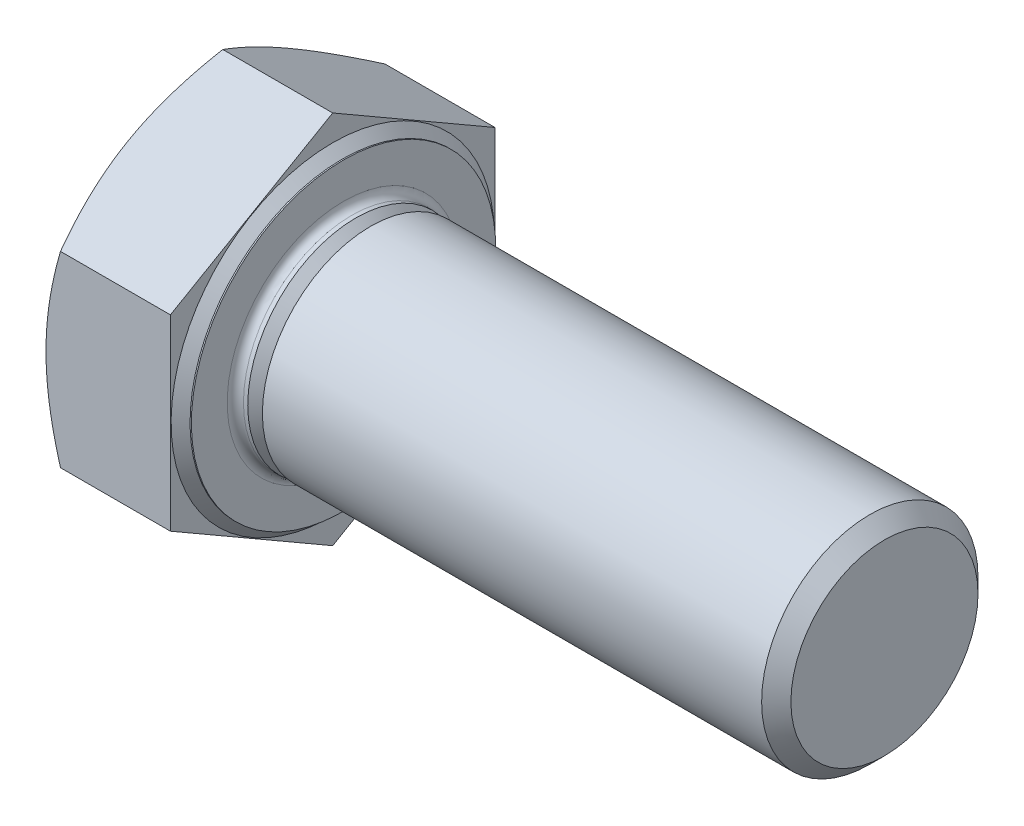
ISO-10303-21;
HEADER;
FILE_DESCRIPTION(('STEP AP214'),'2;1');
FILE_NAME('part.step','',(''),(''),'','','');
FILE_SCHEMA(('AUTOMOTIVE_DESIGN { 1 0 10303 214 1 1 1 1 }'));
ENDSEC;
DATA;
#1=APPLICATION_CONTEXT('core data for automotive mechanical design processes');
#2=APPLICATION_PROTOCOL_DEFINITION('international standard','automotive_design',2000,#1);
#3=PRODUCT_CONTEXT('',#1,'mechanical');
#4=PRODUCT('Part','Part','',(#3));
#5=PRODUCT_RELATED_PRODUCT_CATEGORY('part','',(#4));
#6=PRODUCT_DEFINITION_FORMATION('','',#4);
#7=PRODUCT_DEFINITION_CONTEXT('part definition',#1,'design');
#8=PRODUCT_DEFINITION('design','',#6,#7);
#9=PRODUCT_DEFINITION_SHAPE('','',#8);
#10=(LENGTH_UNIT() NAMED_UNIT(*) SI_UNIT(.MILLI.,.METRE.));
#11=(NAMED_UNIT(*) PLANE_ANGLE_UNIT() SI_UNIT($,.RADIAN.));
#12=(NAMED_UNIT(*) SI_UNIT($,.STERADIAN.) SOLID_ANGLE_UNIT());
#13=UNCERTAINTY_MEASURE_WITH_UNIT(LENGTH_MEASURE(1.E-05),#10,'distance_accuracy_value','');
#14=(GEOMETRIC_REPRESENTATION_CONTEXT(3) GLOBAL_UNCERTAINTY_ASSIGNED_CONTEXT((#13)) GLOBAL_UNIT_ASSIGNED_CONTEXT((#10,
#11,#12)) REPRESENTATION_CONTEXT('',''));
#15=CARTESIAN_POINT('',(0.,0.,0.));
#16=DIRECTION('',(0.,0.,1.));
#17=DIRECTION('',(1.,0.,0.));
#18=AXIS2_PLACEMENT_3D('',#15,#16,#17);
#19=CARTESIAN_POINT('',(0.35,0.,0.));
#20=DIRECTION('',(-1.,0.,0.));
#21=DIRECTION('',(0.,1.,0.));
#22=AXIS2_PLACEMENT_3D('',#19,#20,#21);
#23=CONICAL_SURFACE('',#22,11.6,0.785398163397448);
#24=CARTESIAN_POINT('',(0.7,0.,0.));
#25=DIRECTION('',(1.,0.,0.));
#26=DIRECTION('',(0.,1.,0.));
#27=AXIS2_PLACEMENT_3D('',#24,#25,#26);
#28=CIRCLE('',#27,11.25);
#29=CARTESIAN_POINT('',(0.7,11.25,0.));
#30=VERTEX_POINT('',#29);
#31=EDGE_CURVE('E10',#30,#30,#28,.T.);
#32=ORIENTED_EDGE('',*,*,#31,.F.);
#33=EDGE_LOOP('',(#32));
#34=FACE_BOUND('',#33,.T.);
#35=CARTESIAN_POINT('',(0.,0.,0.));
#36=DIRECTION('',(-1.,0.,0.));
#37=DIRECTION('',(0.,1.,0.));
#38=AXIS2_PLACEMENT_3D('',#35,#36,#37);
#39=CIRCLE('',#38,11.95);
#40=CARTESIAN_POINT('',(0.,11.95,0.));
#41=VERTEX_POINT('',#40);
#42=EDGE_CURVE('E262',#41,#41,#39,.T.);
#43=ORIENTED_EDGE('',*,*,#42,.F.);
#44=EDGE_LOOP('',(#43));
#45=FACE_BOUND('',#44,.T.);
#46=ADVANCED_FACE('F15',(#34,#45),#23,.T.);
#47=CARTESIAN_POINT('',(0.75,0.,0.));
#48=DIRECTION('',(-1.,0.,0.));
#49=DIRECTION('',(0.,1.,0.));
#50=AXIS2_PLACEMENT_3D('',#47,#48,#49);
#51=CYLINDRICAL_SURFACE('',#50,11.25);
#52=CARTESIAN_POINT('',(0.8,0.,0.));
#53=DIRECTION('',(1.,0.,0.));
#54=DIRECTION('',(0.,1.,0.));
#55=AXIS2_PLACEMENT_3D('',#52,#53,#54);
#56=CIRCLE('',#55,11.25);
#57=CARTESIAN_POINT('',(0.8,11.25,0.));
#58=VERTEX_POINT('',#57);
#59=EDGE_CURVE('E25',#58,#58,#56,.T.);
#60=ORIENTED_EDGE('',*,*,#59,.F.);
#61=EDGE_LOOP('',(#60));
#62=FACE_BOUND('',#61,.T.);
#63=ORIENTED_EDGE('',*,*,#31,.T.);
#64=EDGE_LOOP('',(#63));
#65=FACE_BOUND('',#64,.T.);
#66=ADVANCED_FACE('F315',(#62,#65),#51,.T.);
#67=CARTESIAN_POINT('',(0.8,9.925,0.));
#68=DIRECTION('',(1.,0.,0.));
#69=DIRECTION('',(0.,1.,0.));
#70=AXIS2_PLACEMENT_3D('',#67,#68,#69);
#71=PLANE('',#70);
#72=CARTESIAN_POINT('',(0.8,0.,0.));
#73=DIRECTION('',(1.,0.,0.));
#74=DIRECTION('',(0.,1.,0.));
#75=AXIS2_PLACEMENT_3D('',#72,#73,#74);
#76=CIRCLE('',#75,8.6);
#77=CARTESIAN_POINT('',(0.8,8.6,0.));
#78=VERTEX_POINT('',#77);
#79=EDGE_CURVE('E199',#78,#78,#76,.T.);
#80=ORIENTED_EDGE('',*,*,#79,.F.);
#81=EDGE_LOOP('',(#80));
#82=FACE_BOUND('',#81,.T.);
#83=ORIENTED_EDGE('',*,*,#59,.T.);
#84=EDGE_LOOP('',(#83));
#85=FACE_BOUND('',#84,.T.);
#86=ADVANCED_FACE('F320',(#82,#85),#71,.T.);
#87=CARTESIAN_POINT('',(1.4,0.,0.));
#88=DIRECTION('',(1.,0.,0.));
#89=DIRECTION('',(0.,0.,-1.));
#90=AXIS2_PLACEMENT_3D('',#87,#88,#89);
#91=TOROIDAL_SURFACE('',#90,8.6,0.6);
#92=CARTESIAN_POINT('',(1.4,0.,0.));
#93=DIRECTION('',(1.,0.,0.));
#94=DIRECTION('',(0.,1.,0.));
#95=AXIS2_PLACEMENT_3D('',#92,#93,#94);
#96=CIRCLE('',#95,8.);
#97=CARTESIAN_POINT('',(1.4,8.,0.));
#98=VERTEX_POINT('',#97);
#99=EDGE_CURVE('E201',#98,#98,#96,.T.);
#100=ORIENTED_EDGE('',*,*,#99,.F.);
#101=EDGE_LOOP('',(#100));
#102=FACE_BOUND('',#101,.T.);
#103=ORIENTED_EDGE('',*,*,#79,.T.);
#104=EDGE_LOOP('',(#103));
#105=FACE_BOUND('',#104,.T.);
#106=ADVANCED_FACE('F346',(#102,#105),#91,.F.);
#107=CARTESIAN_POINT('',(-0.0612500000000011,0.,0.));
#108=DIRECTION('',(-1.,0.,0.));
#109=DIRECTION('',(0.,1.,0.));
#110=AXIS2_PLACEMENT_3D('',#107,#108,#109);
#111=CYLINDRICAL_SURFACE('',#110,8.);
#112=ORIENTED_EDGE('',*,*,#99,.T.);
#113=EDGE_LOOP('',(#112));
#114=FACE_BOUND('',#113,.T.);
#115=CARTESIAN_POINT('',(1.7175,0.,0.));
#116=DIRECTION('',(1.,0.,0.));
#117=DIRECTION('',(0.,1.,0.));
#118=AXIS2_PLACEMENT_3D('',#115,#116,#117);
#119=CIRCLE('',#118,8.);
#120=CARTESIAN_POINT('',(1.7175,8.,0.));
#121=VERTEX_POINT('',#120);
#122=EDGE_CURVE('E211',#121,#121,#119,.T.);
#123=ORIENTED_EDGE('',*,*,#122,.F.);
#124=EDGE_LOOP('',(#123));
#125=FACE_BOUND('',#124,.T.);
#126=ADVANCED_FACE('F343',(#114,#125),#111,.T.);
#127=CARTESIAN_POINT('',(2.25875,0.,0.));
#128=DIRECTION('',(-1.,0.,0.));
#129=DIRECTION('',(0.,1.,0.));
#130=AXIS2_PLACEMENT_3D('',#127,#128,#129);
#131=CONICAL_SURFACE('',#130,7.45875,0.785398163397448);
#132=CARTESIAN_POINT('',(2.8,0.,0.));
#133=DIRECTION('',(1.,0.,0.));
#134=DIRECTION('',(0.,1.,0.));
#135=AXIS2_PLACEMENT_3D('',#132,#133,#134);
#136=CIRCLE('',#135,6.9175);
#137=CARTESIAN_POINT('',(2.8,6.9175,0.));
#138=VERTEX_POINT('',#137);
#139=EDGE_CURVE('E81',#138,#138,#136,.T.);
#140=ORIENTED_EDGE('',*,*,#139,.F.);
#141=EDGE_LOOP('',(#140));
#142=FACE_BOUND('',#141,.T.);
#143=ORIENTED_EDGE('',*,*,#122,.T.);
#144=EDGE_LOOP('',(#143));
#145=FACE_BOUND('',#144,.T.);
#146=ADVANCED_FACE('F331',(#142,#145),#131,.T.);
#147=CARTESIAN_POINT('',(2.8,7.45875,0.));
#148=DIRECTION('',(-1.,0.,0.));
#149=DIRECTION('',(0.,-1.,0.));
#150=AXIS2_PLACEMENT_3D('',#147,#148,#149);
#151=PLANE('',#150);
#152=CARTESIAN_POINT('',(2.8,0.,0.));
#153=DIRECTION('',(1.,0.,0.));
#154=DIRECTION('',(0.,1.,0.));
#155=AXIS2_PLACEMENT_3D('',#152,#153,#154);
#156=CIRCLE('',#155,8.);
#157=CARTESIAN_POINT('',(2.8,8.,0.));
#158=VERTEX_POINT('',#157);
#159=EDGE_CURVE('E19',#158,#158,#156,.T.);
#160=ORIENTED_EDGE('',*,*,#159,.F.);
#161=EDGE_LOOP('',(#160));
#162=FACE_BOUND('',#161,.T.);
#163=ORIENTED_EDGE('',*,*,#139,.T.);
#164=EDGE_LOOP('',(#163));
#165=FACE_BOUND('',#164,.T.);
#166=ADVANCED_FACE('F327',(#162,#165),#151,.T.);
#167=CARTESIAN_POINT('',(21.25875,0.,0.));
#168=DIRECTION('',(-1.,0.,0.));
#169=DIRECTION('',(0.,1.,0.));
#170=AXIS2_PLACEMENT_3D('',#167,#168,#169);
#171=CYLINDRICAL_SURFACE('',#170,8.);
#172=CARTESIAN_POINT('',(39.7175,0.,0.));
#173=DIRECTION('',(1.,0.,0.));
#174=DIRECTION('',(0.,1.,0.));
#175=AXIS2_PLACEMENT_3D('',#172,#173,#174);
#176=CIRCLE('',#175,8.);
#177=CARTESIAN_POINT('',(39.7175,8.,0.));
#178=VERTEX_POINT('',#177);
#179=EDGE_CURVE('E134',#178,#178,#176,.T.);
#180=ORIENTED_EDGE('',*,*,#179,.F.);
#181=EDGE_LOOP('',(#180));
#182=FACE_BOUND('',#181,.T.);
#183=ORIENTED_EDGE('',*,*,#159,.T.);
#184=EDGE_LOOP('',(#183));
#185=FACE_BOUND('',#184,.T.);
#186=ADVANCED_FACE('F330',(#182,#185),#171,.T.);
#187=CARTESIAN_POINT('',(40.25875,0.,0.));
#188=DIRECTION('',(-1.,0.,0.));
#189=DIRECTION('',(0.,1.,0.));
#190=AXIS2_PLACEMENT_3D('',#187,#188,#189);
#191=CONICAL_SURFACE('',#190,7.45875,0.78539816339745);
#192=CARTESIAN_POINT('',(40.8,0.,0.));
#193=DIRECTION('',(1.,0.,0.));
#194=DIRECTION('',(0.,1.,0.));
#195=AXIS2_PLACEMENT_3D('',#192,#193,#194);
#196=CIRCLE('',#195,6.9175);
#197=CARTESIAN_POINT('',(40.8,6.9175,0.));
#198=VERTEX_POINT('',#197);
#199=EDGE_CURVE('E137',#198,#198,#196,.T.);
#200=ORIENTED_EDGE('',*,*,#199,.F.);
#201=EDGE_LOOP('',(#200));
#202=FACE_BOUND('',#201,.T.);
#203=ORIENTED_EDGE('',*,*,#179,.T.);
#204=EDGE_LOOP('',(#203));
#205=FACE_BOUND('',#204,.T.);
#206=ADVANCED_FACE('F338',(#202,#205),#191,.T.);
#207=CARTESIAN_POINT('',(40.8,3.45875,0.));
#208=DIRECTION('',(1.,0.,0.));
#209=DIRECTION('',(0.,1.,0.));
#210=AXIS2_PLACEMENT_3D('',#207,#208,#209);
#211=PLANE('',#210);
#212=ORIENTED_EDGE('',*,*,#199,.T.);
#213=EDGE_LOOP('',(#212));
#214=FACE_BOUND('',#213,.T.);
#215=ADVANCED_FACE('F336',(#214),#211,.T.);
#216=CARTESIAN_POINT('',(-8.66306424965365,0.,0.));
#217=DIRECTION('',(1.,0.,0.));
#218=DIRECTION('',(0.,1.,0.));
#219=AXIS2_PLACEMENT_3D('',#216,#217,#218);
#220=CONICAL_SURFACE('',#219,12.93,1.0471975511966);
#221=CARTESIAN_POINT('',(-8.1261284993073,-6.92461108730832,-12.0062217741272));
#222=CARTESIAN_POINT('',(-9.2,-8.78316621056178,-8.78710987198479));
#223=CARTESIAN_POINT('',(-9.2,-10.3923048454133,-6.));
#224=CARTESIAN_POINT('',(-9.2,-12.0014434802647,-3.21289012801521));
#225=CARTESIAN_POINT('',(-8.1261284993073,-13.8599986035182,0.0062217741272192));
#226=(BOUNDED_CURVE() B_SPLINE_CURVE(2,(#221,#222,#223,#224,#225),.UNSPECIFIED.,.F.,
.F.) B_SPLINE_CURVE_WITH_KNOTS((3,2,3),(0.,7.03597967701703,14.0719593540341),
.UNSPECIFIED.) CURVE() GEOMETRIC_REPRESENTATION_ITEM() RATIONAL_B_SPLINE_CURVE((1.,
1.03802697460133,1.,1.03802697460134,1.)) REPRESENTATION_ITEM(''));
#227=CARTESIAN_POINT('',(-8.12820323027551,-6.9282032302755,-12.));
#228=VERTEX_POINT('',#227);
#229=CARTESIAN_POINT('',(-9.2,-10.3923048454133,-6.));
#230=VERTEX_POINT('',#229);
#231=EDGE_CURVE('E235',#228,#230,#226,.T.);
#232=ORIENTED_EDGE('',*,*,#231,.T.);
#233=CARTESIAN_POINT('',(-9.2,0.,0.));
#234=DIRECTION('',(1.,0.,0.));
#235=DIRECTION('',(0.,1.,0.));
#236=AXIS2_PLACEMENT_3D('',#233,#234,#235);
#237=CIRCLE('',#236,12.);
#238=CARTESIAN_POINT('',(-9.2,0.,-12.));
#239=VERTEX_POINT('',#238);
#240=EDGE_CURVE('E249',#230,#239,#237,.T.);
#241=ORIENTED_EDGE('',*,*,#240,.T.);
#242=CARTESIAN_POINT('',(-8.1261284993073,6.9353875162099,-12.));
#243=CARTESIAN_POINT('',(-9.20000000000001,3.21827726970298,-12.));
#244=CARTESIAN_POINT('',(-9.2,0.,-12.));
#245=CARTESIAN_POINT('',(-9.20000000000001,-3.21827726970298,-12.));
#246=CARTESIAN_POINT('',(-8.1261284993073,-6.93538751620989,-12.));
#247=(BOUNDED_CURVE() B_SPLINE_CURVE(2,(#242,#243,#244,#245,#246),.UNSPECIFIED.,.F.,
.F.) B_SPLINE_CURVE_WITH_KNOTS((3,2,3),(0.,7.03597967701704,14.0719593540341),
.UNSPECIFIED.) CURVE() GEOMETRIC_REPRESENTATION_ITEM() RATIONAL_B_SPLINE_CURVE((1.,
1.03802697460134,1.,1.03802697460134,1.)) REPRESENTATION_ITEM(''));
#248=EDGE_CURVE('E168',#239,#228,#247,.T.);
#249=ORIENTED_EDGE('',*,*,#248,.T.);
#250=EDGE_LOOP('',(#232,#241,#249));
#251=FACE_BOUND('',#250,.T.);
#252=ADVANCED_FACE('F274',(#251),#220,.T.);
#253=CARTESIAN_POINT('',(-8.66306424965365,0.,0.));
#254=DIRECTION('',(1.,0.,0.));
#255=DIRECTION('',(0.,1.,0.));
#256=AXIS2_PLACEMENT_3D('',#253,#254,#255);
#257=CONICAL_SURFACE('',#256,12.93,1.0471975511966);
#258=CARTESIAN_POINT('',(-8.1261284993073,-13.8599986035182,-0.00622177412722682));
#259=CARTESIAN_POINT('',(-9.19999999999999,-12.0014434802647,3.21289012801522));
#260=CARTESIAN_POINT('',(-9.2,-10.3923048454133,6.));
#261=CARTESIAN_POINT('',(-9.20000000000001,-8.7831662105618,8.78710987198478));
#262=CARTESIAN_POINT('',(-8.1261284993073,-6.92461108730832,12.0062217741272));
#263=(BOUNDED_CURVE() B_SPLINE_CURVE(2,(#258,#259,#260,#261,#262),.UNSPECIFIED.,.F.,
.F.) B_SPLINE_CURVE_WITH_KNOTS((3,2,3),(0.,7.03597967701703,14.0719593540341),
.UNSPECIFIED.) CURVE() GEOMETRIC_REPRESENTATION_ITEM() RATIONAL_B_SPLINE_CURVE((1.,
1.03802697460133,1.,1.03802697460133,1.)) REPRESENTATION_ITEM(''));
#264=CARTESIAN_POINT('',(-8.12820323027551,-13.856406460551,0.));
#265=VERTEX_POINT('',#264);
#266=CARTESIAN_POINT('',(-9.2,-10.3923048454133,6.));
#267=VERTEX_POINT('',#266);
#268=EDGE_CURVE('E149',#265,#267,#263,.T.);
#269=ORIENTED_EDGE('',*,*,#268,.T.);
#270=CARTESIAN_POINT('',(-9.2,0.,0.));
#271=DIRECTION('',(1.,0.,0.));
#272=DIRECTION('',(0.,1.,0.));
#273=AXIS2_PLACEMENT_3D('',#270,#271,#272);
#274=CIRCLE('',#273,12.);
#275=EDGE_CURVE('E146',#267,#230,#274,.T.);
#276=ORIENTED_EDGE('',*,*,#275,.T.);
#277=CARTESIAN_POINT('',(-8.1261284993073,-6.92461108730832,-12.0062217741272));
#278=CARTESIAN_POINT('',(-9.2,-8.78316621056178,-8.78710987198479));
#279=CARTESIAN_POINT('',(-9.2,-10.3923048454133,-6.));
#280=CARTESIAN_POINT('',(-9.2,-12.0014434802647,-3.21289012801521));
#281=CARTESIAN_POINT('',(-8.1261284993073,-13.8599986035182,0.0062217741272192));
#282=(BOUNDED_CURVE() B_SPLINE_CURVE(2,(#277,#278,#279,#280,#281),.UNSPECIFIED.,.F.,
.F.) B_SPLINE_CURVE_WITH_KNOTS((3,2,3),(0.,7.03597967701703,14.0719593540341),
.UNSPECIFIED.) CURVE() GEOMETRIC_REPRESENTATION_ITEM() RATIONAL_B_SPLINE_CURVE((1.,
1.03802697460133,1.,1.03802697460134,1.)) REPRESENTATION_ITEM(''));
#283=EDGE_CURVE('E150',#230,#265,#282,.T.);
#284=ORIENTED_EDGE('',*,*,#283,.T.);
#285=EDGE_LOOP('',(#269,#276,#284));
#286=FACE_BOUND('',#285,.T.);
#287=ADVANCED_FACE('F285',(#286),#257,.T.);
#288=CARTESIAN_POINT('',(-8.66306424965365,0.,0.));
#289=DIRECTION('',(1.,0.,0.));
#290=DIRECTION('',(0.,1.,0.));
#291=AXIS2_PLACEMENT_3D('',#288,#289,#290);
#292=CONICAL_SURFACE('',#291,12.93,1.0471975511966);
#293=CARTESIAN_POINT('',(-8.1261284993073,-6.9353875162099,12.));
#294=CARTESIAN_POINT('',(-9.19999999999999,-3.21827726970298,12.));
#295=CARTESIAN_POINT('',(-9.2,0.,12.));
#296=CARTESIAN_POINT('',(-9.2,3.21827726970297,12.));
#297=CARTESIAN_POINT('',(-8.1261284993073,6.9353875162099,12.));
#298=(BOUNDED_CURVE() B_SPLINE_CURVE(2,(#293,#294,#295,#296,#297),.UNSPECIFIED.,.F.,
.F.) B_SPLINE_CURVE_WITH_KNOTS((3,2,3),(0.,7.03597967701704,14.0719593540341),
.UNSPECIFIED.) CURVE() GEOMETRIC_REPRESENTATION_ITEM() RATIONAL_B_SPLINE_CURVE((1.,
1.03802697460134,1.,1.03802697460135,1.)) REPRESENTATION_ITEM(''));
#299=CARTESIAN_POINT('',(-8.12820323027551,-6.92820323027552,12.));
#300=VERTEX_POINT('',#299);
#301=CARTESIAN_POINT('',(-9.2,0.,12.));
#302=VERTEX_POINT('',#301);
#303=EDGE_CURVE('E229',#300,#302,#298,.T.);
#304=ORIENTED_EDGE('',*,*,#303,.T.);
#305=CARTESIAN_POINT('',(-9.2,0.,0.));
#306=DIRECTION('',(1.,0.,0.));
#307=DIRECTION('',(0.,1.,0.));
#308=AXIS2_PLACEMENT_3D('',#305,#306,#307);
#309=CIRCLE('',#308,12.);
#310=EDGE_CURVE('E219',#302,#267,#309,.T.);
#311=ORIENTED_EDGE('',*,*,#310,.T.);
#312=CARTESIAN_POINT('',(-8.1261284993073,-13.8599986035182,-0.00622177412722682));
#313=CARTESIAN_POINT('',(-9.19999999999999,-12.0014434802647,3.21289012801522));
#314=CARTESIAN_POINT('',(-9.2,-10.3923048454133,6.));
#315=CARTESIAN_POINT('',(-9.20000000000001,-8.7831662105618,8.78710987198478));
#316=CARTESIAN_POINT('',(-8.1261284993073,-6.92461108730832,12.0062217741272));
#317=(BOUNDED_CURVE() B_SPLINE_CURVE(2,(#312,#313,#314,#315,#316),.UNSPECIFIED.,.F.,
.F.) B_SPLINE_CURVE_WITH_KNOTS((3,2,3),(0.,7.03597967701703,14.0719593540341),
.UNSPECIFIED.) CURVE() GEOMETRIC_REPRESENTATION_ITEM() RATIONAL_B_SPLINE_CURVE((1.,
1.03802697460133,1.,1.03802697460133,1.)) REPRESENTATION_ITEM(''));
#318=EDGE_CURVE('E114',#267,#300,#317,.T.);
#319=ORIENTED_EDGE('',*,*,#318,.T.);
#320=EDGE_LOOP('',(#304,#311,#319));
#321=FACE_BOUND('',#320,.T.);
#322=ADVANCED_FACE('F292',(#321),#292,.T.);
#323=CARTESIAN_POINT('',(-8.66306424965365,0.,0.));
#324=DIRECTION('',(1.,0.,0.));
#325=DIRECTION('',(0.,1.,0.));
#326=AXIS2_PLACEMENT_3D('',#323,#324,#325);
#327=CONICAL_SURFACE('',#326,12.93,1.0471975511966);
#328=CARTESIAN_POINT('',(-8.1261284993073,-6.9353875162099,12.));
#329=CARTESIAN_POINT('',(-9.19999999999999,-3.21827726970298,12.));
#330=CARTESIAN_POINT('',(-9.2,0.,12.));
#331=CARTESIAN_POINT('',(-9.2,3.21827726970297,12.));
#332=CARTESIAN_POINT('',(-8.1261284993073,6.9353875162099,12.));
#333=(BOUNDED_CURVE() B_SPLINE_CURVE(2,(#328,#329,#330,#331,#332),.UNSPECIFIED.,.F.,
.F.) B_SPLINE_CURVE_WITH_KNOTS((3,2,3),(0.,7.03597967701704,14.0719593540341),
.UNSPECIFIED.) CURVE() GEOMETRIC_REPRESENTATION_ITEM() RATIONAL_B_SPLINE_CURVE((1.,
1.03802697460134,1.,1.03802697460135,1.)) REPRESENTATION_ITEM(''));
#334=CARTESIAN_POINT('',(-8.12820323027551,6.92820323027551,12.));
#335=VERTEX_POINT('',#334);
#336=EDGE_CURVE('E106',#302,#335,#333,.T.);
#337=ORIENTED_EDGE('',*,*,#336,.T.);
#338=CARTESIAN_POINT('',(-8.12612849930729,6.92461108730831,12.0062217741272));
#339=CARTESIAN_POINT('',(-9.2,8.78316621056177,8.7871098719848));
#340=CARTESIAN_POINT('',(-9.2,10.3923048454133,6.));
#341=CARTESIAN_POINT('',(-9.20000000000001,12.0014434802648,3.21289012801521));
#342=CARTESIAN_POINT('',(-8.1261284993073,13.8599986035182,-0.00622177412722586));
#343=(BOUNDED_CURVE() B_SPLINE_CURVE(2,(#338,#339,#340,#341,#342),.UNSPECIFIED.,.F.,
.F.) B_SPLINE_CURVE_WITH_KNOTS((3,2,3),(0.,7.03597967701704,14.0719593540341),
.UNSPECIFIED.) CURVE() GEOMETRIC_REPRESENTATION_ITEM() RATIONAL_B_SPLINE_CURVE((1.,
1.03802697460134,1.,1.03802697460133,1.)) REPRESENTATION_ITEM(''));
#344=CARTESIAN_POINT('',(-9.2,10.3923048454133,6.));
#345=VERTEX_POINT('',#344);
#346=EDGE_CURVE('E92',#335,#345,#343,.T.);
#347=ORIENTED_EDGE('',*,*,#346,.T.);
#348=CARTESIAN_POINT('',(-9.2,0.,0.));
#349=DIRECTION('',(1.,0.,0.));
#350=DIRECTION('',(0.,1.,0.));
#351=AXIS2_PLACEMENT_3D('',#348,#349,#350);
#352=CIRCLE('',#351,12.);
#353=EDGE_CURVE('E107',#345,#302,#352,.T.);
#354=ORIENTED_EDGE('',*,*,#353,.T.);
#355=EDGE_LOOP('',(#337,#347,#354));
#356=FACE_BOUND('',#355,.T.);
#357=ADVANCED_FACE('F110',(#356),#327,.T.);
#358=CARTESIAN_POINT('',(-8.66306424965365,0.,0.));
#359=DIRECTION('',(1.,0.,0.));
#360=DIRECTION('',(0.,1.,0.));
#361=AXIS2_PLACEMENT_3D('',#358,#359,#360);
#362=CONICAL_SURFACE('',#361,12.93,1.0471975511966);
#363=CARTESIAN_POINT('',(-8.12612849930729,6.92461108730831,12.0062217741272));
#364=CARTESIAN_POINT('',(-9.2,8.78316621056177,8.7871098719848));
#365=CARTESIAN_POINT('',(-9.2,10.3923048454133,6.));
#366=CARTESIAN_POINT('',(-9.20000000000001,12.0014434802648,3.21289012801521));
#367=CARTESIAN_POINT('',(-8.1261284993073,13.8599986035182,-0.00622177412722586));
#368=(BOUNDED_CURVE() B_SPLINE_CURVE(2,(#363,#364,#365,#366,#367),.UNSPECIFIED.,.F.,
.F.) B_SPLINE_CURVE_WITH_KNOTS((3,2,3),(0.,7.03597967701704,14.0719593540341),
.UNSPECIFIED.) CURVE() GEOMETRIC_REPRESENTATION_ITEM() RATIONAL_B_SPLINE_CURVE((1.,
1.03802697460134,1.,1.03802697460133,1.)) REPRESENTATION_ITEM(''));
#369=CARTESIAN_POINT('',(-8.12820323027551,13.856406460551,0.));
#370=VERTEX_POINT('',#369);
#371=EDGE_CURVE('E101',#345,#370,#368,.T.);
#372=ORIENTED_EDGE('',*,*,#371,.T.);
#373=CARTESIAN_POINT('',(-8.1261284993073,13.8599986035182,0.00622177412722396));
#374=CARTESIAN_POINT('',(-9.2,12.0014434802647,-3.21289012801521));
#375=CARTESIAN_POINT('',(-9.2,10.3923048454133,-6.));
#376=CARTESIAN_POINT('',(-9.2,8.78316621056178,-8.78710987198479));
#377=CARTESIAN_POINT('',(-8.1261284993073,6.92461108730832,-12.0062217741272));
#378=(BOUNDED_CURVE() B_SPLINE_CURVE(2,(#373,#374,#375,#376,#377),.UNSPECIFIED.,.F.,
.F.) B_SPLINE_CURVE_WITH_KNOTS((3,2,3),(0.,7.03597967701704,14.0719593540341),
.UNSPECIFIED.) CURVE() GEOMETRIC_REPRESENTATION_ITEM() RATIONAL_B_SPLINE_CURVE((1.,
1.03802697460134,1.,1.03802697460135,1.)) REPRESENTATION_ITEM(''));
#379=CARTESIAN_POINT('',(-9.2,10.3923048454133,-6.));
#380=VERTEX_POINT('',#379);
#381=EDGE_CURVE('E141',#370,#380,#378,.T.);
#382=ORIENTED_EDGE('',*,*,#381,.T.);
#383=CARTESIAN_POINT('',(-9.2,0.,0.));
#384=DIRECTION('',(1.,0.,0.));
#385=DIRECTION('',(0.,1.,0.));
#386=AXIS2_PLACEMENT_3D('',#383,#384,#385);
#387=CIRCLE('',#386,12.);
#388=EDGE_CURVE('E159',#380,#345,#387,.T.);
#389=ORIENTED_EDGE('',*,*,#388,.T.);
#390=EDGE_LOOP('',(#372,#382,#389));
#391=FACE_BOUND('',#390,.T.);
#392=ADVANCED_FACE('F17',(#391),#362,.T.);
#393=CARTESIAN_POINT('',(-8.66306424965365,0.,0.));
#394=DIRECTION('',(1.,0.,0.));
#395=DIRECTION('',(0.,1.,0.));
#396=AXIS2_PLACEMENT_3D('',#393,#394,#395);
#397=CONICAL_SURFACE('',#396,12.93,1.0471975511966);
#398=CARTESIAN_POINT('',(-8.1261284993073,13.8599986035182,0.00622177412722396));
#399=CARTESIAN_POINT('',(-9.2,12.0014434802647,-3.21289012801521));
#400=CARTESIAN_POINT('',(-9.2,10.3923048454133,-6.));
#401=CARTESIAN_POINT('',(-9.2,8.78316621056178,-8.78710987198479));
#402=CARTESIAN_POINT('',(-8.1261284993073,6.92461108730832,-12.0062217741272));
#403=(BOUNDED_CURVE() B_SPLINE_CURVE(2,(#398,#399,#400,#401,#402),.UNSPECIFIED.,.F.,
.F.) B_SPLINE_CURVE_WITH_KNOTS((3,2,3),(0.,7.03597967701704,14.0719593540341),
.UNSPECIFIED.) CURVE() GEOMETRIC_REPRESENTATION_ITEM() RATIONAL_B_SPLINE_CURVE((1.,
1.03802697460134,1.,1.03802697460135,1.)) REPRESENTATION_ITEM(''));
#404=CARTESIAN_POINT('',(-8.12820323027551,6.92820323027551,-12.));
#405=VERTEX_POINT('',#404);
#406=EDGE_CURVE('E154',#380,#405,#403,.T.);
#407=ORIENTED_EDGE('',*,*,#406,.T.);
#408=CARTESIAN_POINT('',(-8.1261284993073,6.9353875162099,-12.));
#409=CARTESIAN_POINT('',(-9.20000000000001,3.21827726970298,-12.));
#410=CARTESIAN_POINT('',(-9.2,0.,-12.));
#411=CARTESIAN_POINT('',(-9.20000000000001,-3.21827726970298,-12.));
#412=CARTESIAN_POINT('',(-8.1261284993073,-6.93538751620989,-12.));
#413=(BOUNDED_CURVE() B_SPLINE_CURVE(2,(#408,#409,#410,#411,#412),.UNSPECIFIED.,.F.,
.F.) B_SPLINE_CURVE_WITH_KNOTS((3,2,3),(0.,7.03597967701704,14.0719593540341),
.UNSPECIFIED.) CURVE() GEOMETRIC_REPRESENTATION_ITEM() RATIONAL_B_SPLINE_CURVE((1.,
1.03802697460134,1.,1.03802697460134,1.)) REPRESENTATION_ITEM(''));
#414=EDGE_CURVE('E160',#405,#239,#413,.T.);
#415=ORIENTED_EDGE('',*,*,#414,.T.);
#416=CARTESIAN_POINT('',(-9.2,0.,0.));
#417=DIRECTION('',(1.,0.,0.));
#418=DIRECTION('',(0.,1.,0.));
#419=AXIS2_PLACEMENT_3D('',#416,#417,#418);
#420=CIRCLE('',#419,12.);
#421=EDGE_CURVE('E188',#239,#380,#420,.T.);
#422=ORIENTED_EDGE('',*,*,#421,.T.);
#423=EDGE_LOOP('',(#407,#415,#422));
#424=FACE_BOUND('',#423,.T.);
#425=ADVANCED_FACE('F305',(#424),#397,.T.);
#426=CARTESIAN_POINT('',(0.,-10.3923048454133,6.));
#427=DIRECTION('',(0.,-0.866025403784439,0.5));
#428=DIRECTION('',(0.,0.5,0.866025403784439));
#429=AXIS2_PLACEMENT_3D('',#426,#427,#428);
#430=PLANE('',#429);
#431=ORIENTED_EDGE('',*,*,#318,.F.);
#432=ORIENTED_EDGE('',*,*,#268,.F.);
#433=DIRECTION('',(-1.,0.,0.));
#434=VECTOR('',#433,1.);
#435=CARTESIAN_POINT('',(0.,-13.856406460551,0.));
#436=LINE('',#435,#434);
#437=CARTESIAN_POINT('',(0.,-13.856406460551,0.));
#438=VERTEX_POINT('',#437);
#439=EDGE_CURVE('E210',#438,#265,#436,.T.);
#440=ORIENTED_EDGE('',*,*,#439,.F.);
#441=DIRECTION('',(0.,0.5,0.866025403784439));
#442=VECTOR('',#441,1.);
#443=CARTESIAN_POINT('',(0.,-13.856406460551,0.));
#444=LINE('',#443,#442);
#445=CARTESIAN_POINT('',(0.,-6.92820323027552,12.));
#446=VERTEX_POINT('',#445);
#447=EDGE_CURVE('E195',#438,#446,#444,.T.);
#448=ORIENTED_EDGE('',*,*,#447,.T.);
#449=DIRECTION('',(-1.,0.,0.));
#450=VECTOR('',#449,1.);
#451=CARTESIAN_POINT('',(0.,-6.92820323027552,12.));
#452=LINE('',#451,#450);
#453=EDGE_CURVE('E189',#446,#300,#452,.T.);
#454=ORIENTED_EDGE('',*,*,#453,.T.);
#455=EDGE_LOOP('',(#431,#432,#440,#448,#454));
#456=FACE_BOUND('',#455,.T.);
#457=ADVANCED_FACE('F289',(#456),#430,.T.);
#458=CARTESIAN_POINT('',(0.,-10.3923048454133,-6.));
#459=DIRECTION('',(0.,-0.866025403784439,-0.5));
#460=DIRECTION('',(0.,-0.5,0.866025403784439));
#461=AXIS2_PLACEMENT_3D('',#458,#459,#460);
#462=PLANE('',#461);
#463=ORIENTED_EDGE('',*,*,#283,.F.);
#464=ORIENTED_EDGE('',*,*,#231,.F.);
#465=DIRECTION('',(-1.,0.,0.));
#466=VECTOR('',#465,1.);
#467=CARTESIAN_POINT('',(0.,-6.92820323027551,-12.));
#468=LINE('',#467,#466);
#469=CARTESIAN_POINT('',(0.,-6.92820323027551,-12.));
#470=VERTEX_POINT('',#469);
#471=EDGE_CURVE('E133',#470,#228,#468,.T.);
#472=ORIENTED_EDGE('',*,*,#471,.F.);
#473=DIRECTION('',(0.,-0.5,0.866025403784439));
#474=VECTOR('',#473,1.);
#475=CARTESIAN_POINT('',(0.,-6.92820323027551,-12.));
#476=LINE('',#475,#474);
#477=EDGE_CURVE('E196',#470,#438,#476,.T.);
#478=ORIENTED_EDGE('',*,*,#477,.T.);
#479=ORIENTED_EDGE('',*,*,#439,.T.);
#480=EDGE_LOOP('',(#463,#464,#472,#478,#479));
#481=FACE_BOUND('',#480,.T.);
#482=ADVANCED_FACE('F282',(#481),#462,.T.);
#483=CARTESIAN_POINT('',(0.,0.,-12.));
#484=DIRECTION('',(0.,0.,-1.));
#485=DIRECTION('',(0.,-1.,0.));
#486=AXIS2_PLACEMENT_3D('',#483,#484,#485);
#487=PLANE('',#486);
#488=ORIENTED_EDGE('',*,*,#248,.F.);
#489=ORIENTED_EDGE('',*,*,#414,.F.);
#490=DIRECTION('',(-1.,0.,0.));
#491=VECTOR('',#490,1.);
#492=CARTESIAN_POINT('',(0.,6.92820323027551,-12.));
#493=LINE('',#492,#491);
#494=CARTESIAN_POINT('',(0.,6.92820323027551,-12.));
#495=VERTEX_POINT('',#494);
#496=EDGE_CURVE('E125',#495,#405,#493,.T.);
#497=ORIENTED_EDGE('',*,*,#496,.F.);
#498=DIRECTION('',(0.,-1.,0.));
#499=VECTOR('',#498,1.);
#500=CARTESIAN_POINT('',(0.,6.92820323027551,-12.));
#501=LINE('',#500,#499);
#502=EDGE_CURVE('E153',#495,#470,#501,.T.);
#503=ORIENTED_EDGE('',*,*,#502,.T.);
#504=ORIENTED_EDGE('',*,*,#471,.T.);
#505=EDGE_LOOP('',(#488,#489,#497,#503,#504));
#506=FACE_BOUND('',#505,.T.);
#507=ADVANCED_FACE('F332',(#506),#487,.T.);
#508=CARTESIAN_POINT('',(0.,10.3923048454133,6.));
#509=DIRECTION('',(0.,0.866025403784439,0.5));
#510=DIRECTION('',(0.,0.5,-0.866025403784439));
#511=AXIS2_PLACEMENT_3D('',#508,#509,#510);
#512=PLANE('',#511);
#513=ORIENTED_EDGE('',*,*,#346,.F.);
#514=DIRECTION('',(-1.,0.,0.));
#515=VECTOR('',#514,1.);
#516=CARTESIAN_POINT('',(0.,6.92820323027551,12.));
#517=LINE('',#516,#515);
#518=CARTESIAN_POINT('',(0.,6.92820323027551,12.));
#519=VERTEX_POINT('',#518);
#520=EDGE_CURVE('E97',#519,#335,#517,.T.);
#521=ORIENTED_EDGE('',*,*,#520,.F.);
#522=DIRECTION('',(0.,0.5,-0.866025403784439));
#523=VECTOR('',#522,1.);
#524=CARTESIAN_POINT('',(0.,6.92820323027551,12.));
#525=LINE('',#524,#523);
#526=CARTESIAN_POINT('',(0.,13.856406460551,0.));
#527=VERTEX_POINT('',#526);
#528=EDGE_CURVE('E131',#519,#527,#525,.T.);
#529=ORIENTED_EDGE('',*,*,#528,.T.);
#530=DIRECTION('',(-1.,0.,0.));
#531=VECTOR('',#530,1.);
#532=CARTESIAN_POINT('',(0.,13.856406460551,0.));
#533=LINE('',#532,#531);
#534=EDGE_CURVE('E123',#527,#370,#533,.T.);
#535=ORIENTED_EDGE('',*,*,#534,.T.);
#536=ORIENTED_EDGE('',*,*,#371,.F.);
#537=EDGE_LOOP('',(#513,#521,#529,#535,#536));
#538=FACE_BOUND('',#537,.T.);
#539=ADVANCED_FACE('F94',(#538),#512,.T.);
#540=CARTESIAN_POINT('',(0.,0.,12.));
#541=DIRECTION('',(0.,0.,1.));
#542=DIRECTION('',(0.,1.,0.));
#543=AXIS2_PLACEMENT_3D('',#540,#541,#542);
#544=PLANE('',#543);
#545=ORIENTED_EDGE('',*,*,#303,.F.);
#546=ORIENTED_EDGE('',*,*,#453,.F.);
#547=DIRECTION('',(0.,1.,0.));
#548=VECTOR('',#547,1.);
#549=CARTESIAN_POINT('',(0.,-6.92820323027552,12.));
#550=LINE('',#549,#548);
#551=EDGE_CURVE('E120',#446,#519,#550,.T.);
#552=ORIENTED_EDGE('',*,*,#551,.T.);
#553=ORIENTED_EDGE('',*,*,#520,.T.);
#554=ORIENTED_EDGE('',*,*,#336,.F.);
#555=EDGE_LOOP('',(#545,#546,#552,#553,#554));
#556=FACE_BOUND('',#555,.T.);
#557=ADVANCED_FACE('F117',(#556),#544,.T.);
#558=CARTESIAN_POINT('',(0.,10.3923048454133,-6.));
#559=DIRECTION('',(0.,0.866025403784439,-0.5));
#560=DIRECTION('',(0.,-0.5,-0.866025403784439));
#561=AXIS2_PLACEMENT_3D('',#558,#559,#560);
#562=PLANE('',#561);
#563=ORIENTED_EDGE('',*,*,#381,.F.);
#564=ORIENTED_EDGE('',*,*,#534,.F.);
#565=DIRECTION('',(0.,-0.5,-0.866025403784439));
#566=VECTOR('',#565,1.);
#567=CARTESIAN_POINT('',(0.,13.856406460551,0.));
#568=LINE('',#567,#566);
#569=EDGE_CURVE('E121',#527,#495,#568,.T.);
#570=ORIENTED_EDGE('',*,*,#569,.T.);
#571=ORIENTED_EDGE('',*,*,#496,.T.);
#572=ORIENTED_EDGE('',*,*,#406,.F.);
#573=EDGE_LOOP('',(#563,#564,#570,#571,#572));
#574=FACE_BOUND('',#573,.T.);
#575=ADVANCED_FACE('F302',(#574),#562,.T.);
#576=CARTESIAN_POINT('',(-9.2,0.,0.));
#577=DIRECTION('',(-1.,0.,0.));
#578=DIRECTION('',(0.,0.,1.));
#579=AXIS2_PLACEMENT_3D('',#576,#577,#578);
#580=PLANE('',#579);
#581=ORIENTED_EDGE('',*,*,#240,.F.);
#582=ORIENTED_EDGE('',*,*,#275,.F.);
#583=ORIENTED_EDGE('',*,*,#310,.F.);
#584=ORIENTED_EDGE('',*,*,#353,.F.);
#585=ORIENTED_EDGE('',*,*,#388,.F.);
#586=ORIENTED_EDGE('',*,*,#421,.F.);
#587=EDGE_LOOP('',(#581,#582,#583,#584,#585,#586));
#588=FACE_BOUND('',#587,.T.);
#589=ADVANCED_FACE('F326',(#588),#580,.T.);
#590=CARTESIAN_POINT('',(0.,0.,0.));
#591=DIRECTION('',(-1.,0.,0.));
#592=DIRECTION('',(0.,0.,1.));
#593=AXIS2_PLACEMENT_3D('',#590,#591,#592);
#594=PLANE('',#593);
#595=ORIENTED_EDGE('',*,*,#42,.T.);
#596=EDGE_LOOP('',(#595));
#597=FACE_BOUND('',#596,.T.);
#598=ORIENTED_EDGE('',*,*,#569,.F.);
#599=ORIENTED_EDGE('',*,*,#528,.F.);
#600=ORIENTED_EDGE('',*,*,#551,.F.);
#601=ORIENTED_EDGE('',*,*,#447,.F.);
#602=ORIENTED_EDGE('',*,*,#477,.F.);
#603=ORIENTED_EDGE('',*,*,#502,.F.);
#604=EDGE_LOOP('',(#598,#599,#600,#601,#602,#603));
#605=FACE_BOUND('',#604,.T.);
#606=ADVANCED_FACE('F298',(#597,#605),#594,.F.);
#607=CLOSED_SHELL('',(#46,#66,#86,#106,#126,#146,#166,#186,#206,#215,#252,#287,#322,#357,#392,
#425,#457,#482,#507,#539,#557,#575,#589,#606));
#608=MANIFOLD_SOLID_BREP('B1',#607);
#609=ADVANCED_BREP_SHAPE_REPRESENTATION('',(#18,#608),#14);
#610=SHAPE_DEFINITION_REPRESENTATION(#9,#609);
ENDSEC;
END-ISO-10303-21;
